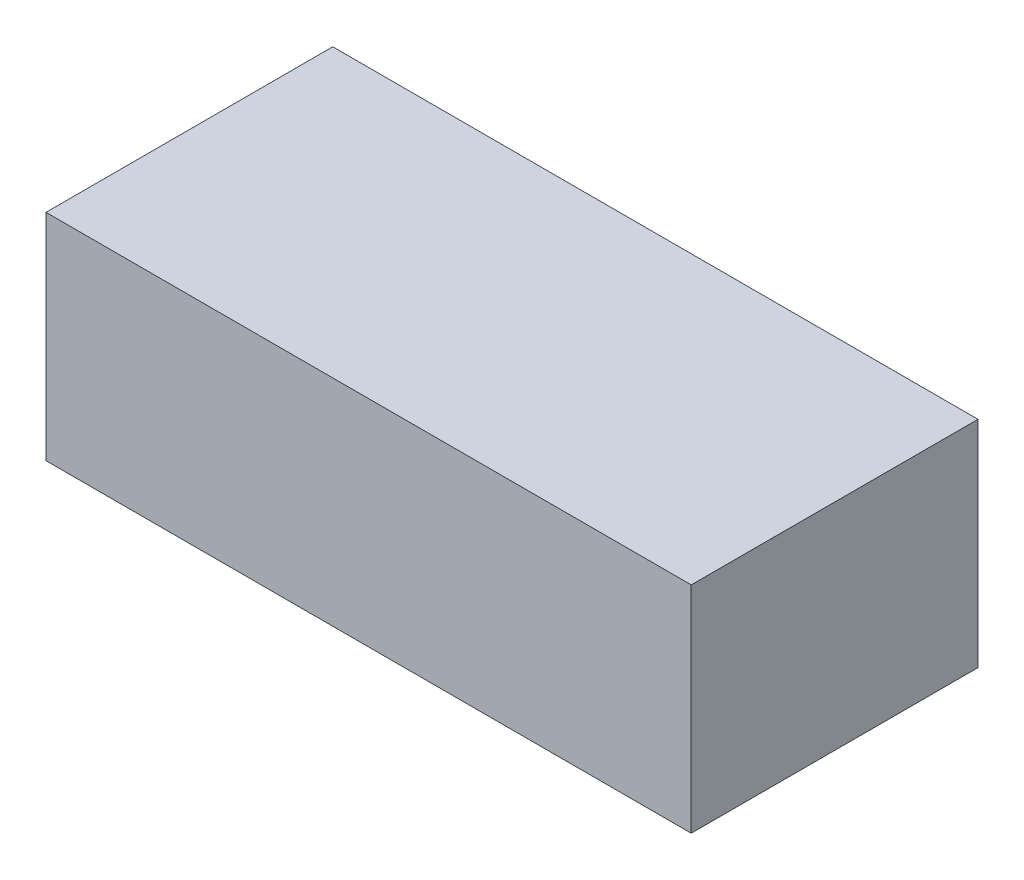
ISO-10303-21;
HEADER;
FILE_DESCRIPTION(('STEP AP214'),'2;1');
FILE_NAME('part.step','',(''),(''),'','','');
FILE_SCHEMA(('AUTOMOTIVE_DESIGN { 1 0 10303 214 1 1 1 1 }'));
ENDSEC;
DATA;
#1=APPLICATION_CONTEXT('core data for automotive mechanical design processes');
#2=APPLICATION_PROTOCOL_DEFINITION('international standard','automotive_design',2000,#1);
#3=PRODUCT_CONTEXT('',#1,'mechanical');
#4=PRODUCT('Part','Part','',(#3));
#5=PRODUCT_RELATED_PRODUCT_CATEGORY('part','',(#4));
#6=PRODUCT_DEFINITION_FORMATION('','',#4);
#7=PRODUCT_DEFINITION_CONTEXT('part definition',#1,'design');
#8=PRODUCT_DEFINITION('design','',#6,#7);
#9=PRODUCT_DEFINITION_SHAPE('','',#8);
#10=(LENGTH_UNIT() NAMED_UNIT(*) SI_UNIT(.MILLI.,.METRE.));
#11=(NAMED_UNIT(*) PLANE_ANGLE_UNIT() SI_UNIT($,.RADIAN.));
#12=(NAMED_UNIT(*) SI_UNIT($,.STERADIAN.) SOLID_ANGLE_UNIT());
#13=UNCERTAINTY_MEASURE_WITH_UNIT(LENGTH_MEASURE(1.E-05),#10,'distance_accuracy_value','');
#14=(GEOMETRIC_REPRESENTATION_CONTEXT(3) GLOBAL_UNCERTAINTY_ASSIGNED_CONTEXT((#13)) GLOBAL_UNIT_ASSIGNED_CONTEXT((#10,
#11,#12)) REPRESENTATION_CONTEXT('',''));
#15=CARTESIAN_POINT('',(0.,0.,0.));
#16=DIRECTION('',(0.,0.,1.));
#17=DIRECTION('',(1.,0.,0.));
#18=AXIS2_PLACEMENT_3D('',#15,#16,#17);
#19=CARTESIAN_POINT('',(-9.,6.,-4.));
#20=DIRECTION('',(1.,0.,0.));
#21=DIRECTION('',(0.,0.,-1.));
#22=AXIS2_PLACEMENT_3D('',#19,#20,#21);
#23=PLANE('',#22);
#24=DIRECTION('',(0.,0.,1.));
#25=VECTOR('',#24,1.);
#26=CARTESIAN_POINT('',(-9.,0.,-4.));
#27=LINE('',#26,#25);
#28=CARTESIAN_POINT('',(-9.,0.,-4.));
#29=VERTEX_POINT('',#28);
#30=CARTESIAN_POINT('',(-9.,0.,4.));
#31=VERTEX_POINT('',#30);
#32=EDGE_CURVE('E96',#29,#31,#27,.T.);
#33=ORIENTED_EDGE('',*,*,#32,.T.);
#34=DIRECTION('',(0.,-1.,0.));
#35=VECTOR('',#34,1.);
#36=CARTESIAN_POINT('',(-9.,6.,4.));
#37=LINE('',#36,#35);
#38=CARTESIAN_POINT('',(-9.,6.,4.));
#39=VERTEX_POINT('',#38);
#40=EDGE_CURVE('E11',#39,#31,#37,.T.);
#41=ORIENTED_EDGE('',*,*,#40,.F.);
#42=DIRECTION('',(0.,0.,1.));
#43=VECTOR('',#42,1.);
#44=CARTESIAN_POINT('',(-9.,6.,-4.));
#45=LINE('',#44,#43);
#46=CARTESIAN_POINT('',(-9.,6.,-4.));
#47=VERTEX_POINT('',#46);
#48=EDGE_CURVE('E82',#47,#39,#45,.T.);
#49=ORIENTED_EDGE('',*,*,#48,.F.);
#50=DIRECTION('',(0.,-1.,0.));
#51=VECTOR('',#50,1.);
#52=CARTESIAN_POINT('',(-9.,6.,-4.));
#53=LINE('',#52,#51);
#54=EDGE_CURVE('E49',#47,#29,#53,.T.);
#55=ORIENTED_EDGE('',*,*,#54,.T.);
#56=EDGE_LOOP('',(#33,#41,#49,#55));
#57=FACE_BOUND('',#56,.T.);
#58=ADVANCED_FACE('F33',(#57),#23,.F.);
#59=CARTESIAN_POINT('',(-9.,6.,4.));
#60=DIRECTION('',(0.,0.,-1.));
#61=DIRECTION('',(-1.,0.,0.));
#62=AXIS2_PLACEMENT_3D('',#59,#60,#61);
#63=PLANE('',#62);
#64=DIRECTION('',(1.,0.,0.));
#65=VECTOR('',#64,1.);
#66=CARTESIAN_POINT('',(-9.,0.,4.));
#67=LINE('',#66,#65);
#68=CARTESIAN_POINT('',(9.,0.,4.));
#69=VERTEX_POINT('',#68);
#70=EDGE_CURVE('E87',#31,#69,#67,.T.);
#71=ORIENTED_EDGE('',*,*,#70,.T.);
#72=DIRECTION('',(0.,-1.,0.));
#73=VECTOR('',#72,1.);
#74=CARTESIAN_POINT('',(9.,6.,4.));
#75=LINE('',#74,#73);
#76=CARTESIAN_POINT('',(9.,6.,4.));
#77=VERTEX_POINT('',#76);
#78=EDGE_CURVE('E41',#77,#69,#75,.T.);
#79=ORIENTED_EDGE('',*,*,#78,.F.);
#80=DIRECTION('',(1.,0.,0.));
#81=VECTOR('',#80,1.);
#82=CARTESIAN_POINT('',(-9.,6.,4.));
#83=LINE('',#82,#81);
#84=EDGE_CURVE('E74',#39,#77,#83,.T.);
#85=ORIENTED_EDGE('',*,*,#84,.F.);
#86=ORIENTED_EDGE('',*,*,#40,.T.);
#87=EDGE_LOOP('',(#71,#79,#85,#86));
#88=FACE_BOUND('',#87,.T.);
#89=ADVANCED_FACE('F86',(#88),#63,.F.);
#90=CARTESIAN_POINT('',(9.,6.,-4.));
#91=DIRECTION('',(1.,0.,0.));
#92=DIRECTION('',(0.,0.,-1.));
#93=AXIS2_PLACEMENT_3D('',#90,#91,#92);
#94=PLANE('',#93);
#95=DIRECTION('',(0.,0.,1.));
#96=VECTOR('',#95,1.);
#97=CARTESIAN_POINT('',(9.,0.,-4.));
#98=LINE('',#97,#96);
#99=CARTESIAN_POINT('',(9.,0.,-4.));
#100=VERTEX_POINT('',#99);
#101=EDGE_CURVE('E99',#100,#69,#98,.T.);
#102=ORIENTED_EDGE('',*,*,#101,.F.);
#103=DIRECTION('',(0.,-1.,0.));
#104=VECTOR('',#103,1.);
#105=CARTESIAN_POINT('',(9.,6.,-4.));
#106=LINE('',#105,#104);
#107=CARTESIAN_POINT('',(9.,6.,-4.));
#108=VERTEX_POINT('',#107);
#109=EDGE_CURVE('E63',#108,#100,#106,.T.);
#110=ORIENTED_EDGE('',*,*,#109,.F.);
#111=DIRECTION('',(0.,0.,1.));
#112=VECTOR('',#111,1.);
#113=CARTESIAN_POINT('',(9.,6.,-4.));
#114=LINE('',#113,#112);
#115=EDGE_CURVE('E81',#108,#77,#114,.T.);
#116=ORIENTED_EDGE('',*,*,#115,.T.);
#117=ORIENTED_EDGE('',*,*,#78,.T.);
#118=EDGE_LOOP('',(#102,#110,#116,#117));
#119=FACE_BOUND('',#118,.T.);
#120=ADVANCED_FACE('F90',(#119),#94,.T.);
#121=CARTESIAN_POINT('',(-9.,6.,-4.));
#122=DIRECTION('',(0.,0.,-1.));
#123=DIRECTION('',(-1.,0.,0.));
#124=AXIS2_PLACEMENT_3D('',#121,#122,#123);
#125=PLANE('',#124);
#126=DIRECTION('',(1.,0.,0.));
#127=VECTOR('',#126,1.);
#128=CARTESIAN_POINT('',(-9.,0.,-4.));
#129=LINE('',#128,#127);
#130=EDGE_CURVE('E101',#29,#100,#129,.T.);
#131=ORIENTED_EDGE('',*,*,#130,.F.);
#132=ORIENTED_EDGE('',*,*,#54,.F.);
#133=DIRECTION('',(1.,0.,0.));
#134=VECTOR('',#133,1.);
#135=CARTESIAN_POINT('',(-9.,6.,-4.));
#136=LINE('',#135,#134);
#137=EDGE_CURVE('E91',#47,#108,#136,.T.);
#138=ORIENTED_EDGE('',*,*,#137,.T.);
#139=ORIENTED_EDGE('',*,*,#109,.T.);
#140=EDGE_LOOP('',(#131,#132,#138,#139));
#141=FACE_BOUND('',#140,.T.);
#142=ADVANCED_FACE('F107',(#141),#125,.T.);
#143=CARTESIAN_POINT('',(0.,6.,0.));
#144=DIRECTION('',(0.,1.,0.));
#145=DIRECTION('',(0.,0.,1.));
#146=AXIS2_PLACEMENT_3D('',#143,#144,#145);
#147=PLANE('',#146);
#148=ORIENTED_EDGE('',*,*,#48,.T.);
#149=ORIENTED_EDGE('',*,*,#84,.T.);
#150=ORIENTED_EDGE('',*,*,#115,.F.);
#151=ORIENTED_EDGE('',*,*,#137,.F.);
#152=EDGE_LOOP('',(#148,#149,#150,#151));
#153=FACE_BOUND('',#152,.T.);
#154=ADVANCED_FACE('F78',(#153),#147,.T.);
#155=CARTESIAN_POINT('',(0.,0.,0.));
#156=DIRECTION('',(0.,1.,0.));
#157=DIRECTION('',(0.,0.,1.));
#158=AXIS2_PLACEMENT_3D('',#155,#156,#157);
#159=PLANE('',#158);
#160=ORIENTED_EDGE('',*,*,#32,.F.);
#161=ORIENTED_EDGE('',*,*,#130,.T.);
#162=ORIENTED_EDGE('',*,*,#101,.T.);
#163=ORIENTED_EDGE('',*,*,#70,.F.);
#164=EDGE_LOOP('',(#160,#161,#162,#163));
#165=FACE_BOUND('',#164,.T.);
#166=ADVANCED_FACE('F106',(#165),#159,.F.);
#167=CLOSED_SHELL('',(#58,#89,#120,#142,#154,#166));
#168=MANIFOLD_SOLID_BREP('B2',#167);
#169=ADVANCED_BREP_SHAPE_REPRESENTATION('',(#18,#168),#14);
#170=SHAPE_DEFINITION_REPRESENTATION(#9,#169);
ENDSEC;
END-ISO-10303-21;
